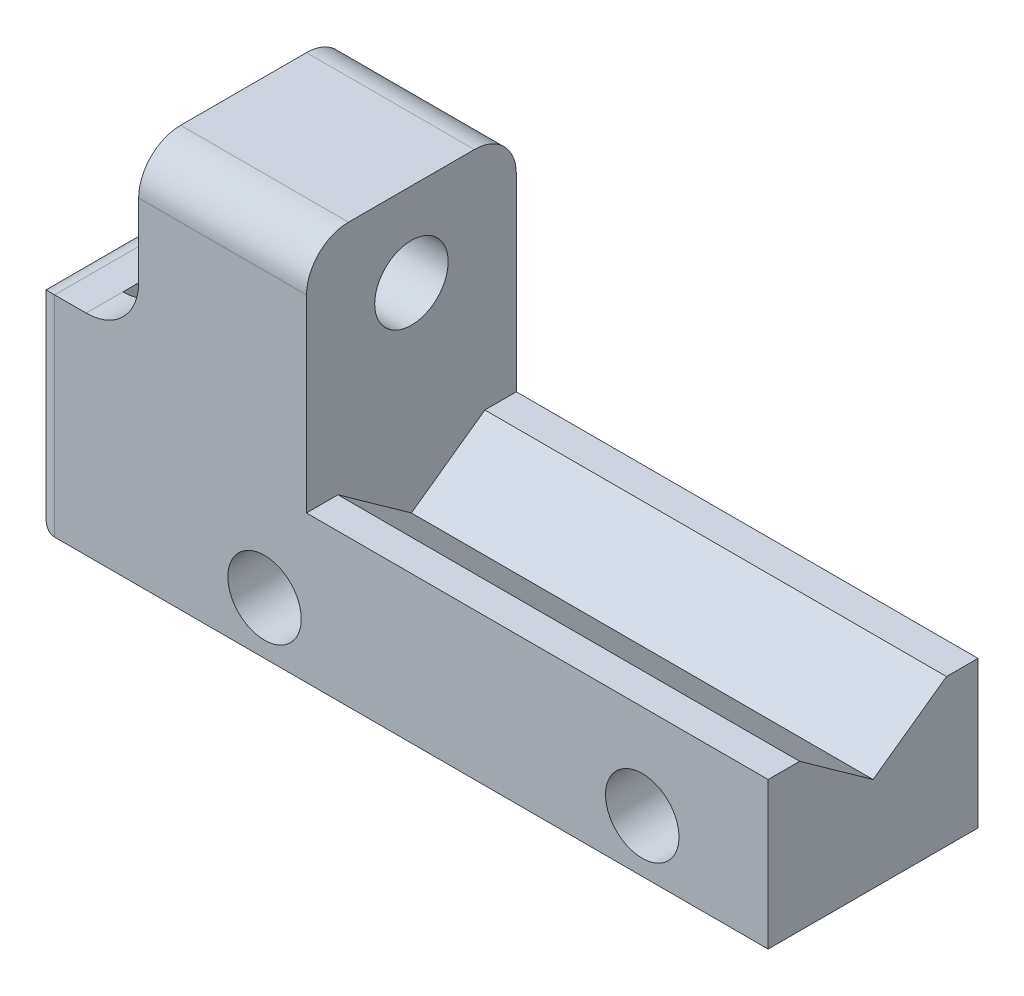
ISO-10303-21;
HEADER;
FILE_DESCRIPTION(('STEP AP214'),'2;1');
FILE_NAME('part.step','',(''),(''),'','','');
FILE_SCHEMA(('AUTOMOTIVE_DESIGN { 1 0 10303 214 1 1 1 1 }'));
ENDSEC;
DATA;
#1=APPLICATION_CONTEXT('core data for automotive mechanical design processes');
#2=APPLICATION_PROTOCOL_DEFINITION('international standard','automotive_design',2000,#1);
#3=PRODUCT_CONTEXT('',#1,'mechanical');
#4=PRODUCT('Part','Part','',(#3));
#5=PRODUCT_RELATED_PRODUCT_CATEGORY('part','',(#4));
#6=PRODUCT_DEFINITION_FORMATION('','',#4);
#7=PRODUCT_DEFINITION_CONTEXT('part definition',#1,'design');
#8=PRODUCT_DEFINITION('design','',#6,#7);
#9=PRODUCT_DEFINITION_SHAPE('','',#8);
#10=(LENGTH_UNIT() NAMED_UNIT(*) SI_UNIT(.MILLI.,.METRE.));
#11=(NAMED_UNIT(*) PLANE_ANGLE_UNIT() SI_UNIT($,.RADIAN.));
#12=(NAMED_UNIT(*) SI_UNIT($,.STERADIAN.) SOLID_ANGLE_UNIT());
#13=UNCERTAINTY_MEASURE_WITH_UNIT(LENGTH_MEASURE(1.E-05),#10,'distance_accuracy_value','');
#14=(GEOMETRIC_REPRESENTATION_CONTEXT(3) GLOBAL_UNCERTAINTY_ASSIGNED_CONTEXT((#13)) GLOBAL_UNIT_ASSIGNED_CONTEXT((#10,
#11,#12)) REPRESENTATION_CONTEXT('',''));
#15=CARTESIAN_POINT('',(0.,0.,0.));
#16=DIRECTION('',(0.,0.,1.));
#17=DIRECTION('',(1.,0.,0.));
#18=AXIS2_PLACEMENT_3D('',#15,#16,#17);
#19=CARTESIAN_POINT('',(-18.5,0.,0.));
#20=DIRECTION('',(1.,0.,0.));
#21=DIRECTION('',(0.,0.,-1.));
#22=AXIS2_PLACEMENT_3D('',#19,#20,#21);
#23=PLANE('',#22);
#24=DIRECTION('',(0.,0.,-1.));
#25=VECTOR('',#24,1.);
#26=CARTESIAN_POINT('',(-18.5,4.5,0.));
#27=LINE('',#26,#25);
#28=CARTESIAN_POINT('',(-18.5,4.5,9.));
#29=VERTEX_POINT('',#28);
#30=CARTESIAN_POINT('',(-18.5,4.5,1.));
#31=VERTEX_POINT('',#30);
#32=EDGE_CURVE('E372',#29,#31,#27,.T.);
#33=ORIENTED_EDGE('',*,*,#32,.T.);
#34=DIRECTION('',(0.,-1.,0.));
#35=VECTOR('',#34,1.);
#36=CARTESIAN_POINT('',(-18.5,0.,1.));
#37=LINE('',#36,#35);
#38=CARTESIAN_POINT('',(-18.5,-3.5,1.));
#39=VERTEX_POINT('',#38);
#40=EDGE_CURVE('E306',#31,#39,#37,.T.);
#41=ORIENTED_EDGE('',*,*,#40,.T.);
#42=DIRECTION('',(0.,0.,1.));
#43=VECTOR('',#42,1.);
#44=CARTESIAN_POINT('',(-18.5,-3.5,0.));
#45=LINE('',#44,#43);
#46=CARTESIAN_POINT('',(-18.5,-3.5,9.));
#47=VERTEX_POINT('',#46);
#48=EDGE_CURVE('E375',#39,#47,#45,.T.);
#49=ORIENTED_EDGE('',*,*,#48,.T.);
#50=DIRECTION('',(0.,1.,0.));
#51=VECTOR('',#50,1.);
#52=CARTESIAN_POINT('',(-18.5,5.5,9.));
#53=LINE('',#52,#51);
#54=EDGE_CURVE('E374',#47,#29,#53,.T.);
#55=ORIENTED_EDGE('',*,*,#54,.T.);
#56=EDGE_LOOP('',(#33,#41,#49,#55));
#57=FACE_BOUND('',#56,.T.);
#58=DIRECTION('',(0.,0.,1.));
#59=VECTOR('',#58,1.);
#60=CARTESIAN_POINT('',(-18.5,1.75,0.));
#61=LINE('',#60,#59);
#62=CARTESIAN_POINT('',(-18.5,1.75,1.75));
#63=VERTEX_POINT('',#62);
#64=CARTESIAN_POINT('',(-18.5,1.75,8.25));
#65=VERTEX_POINT('',#64);
#66=EDGE_CURVE('E221',#63,#65,#61,.T.);
#67=ORIENTED_EDGE('',*,*,#66,.T.);
#68=DIRECTION('',(0.,-1.,0.));
#69=VECTOR('',#68,1.);
#70=CARTESIAN_POINT('',(-18.5,0.,8.25));
#71=LINE('',#70,#69);
#72=CARTESIAN_POINT('',(-18.5,-0.75,8.25));
#73=VERTEX_POINT('',#72);
#74=EDGE_CURVE('E228',#65,#73,#71,.T.);
#75=ORIENTED_EDGE('',*,*,#74,.T.);
#76=DIRECTION('',(0.,0.,-1.));
#77=VECTOR('',#76,1.);
#78=CARTESIAN_POINT('',(-18.5,-0.75,0.));
#79=LINE('',#78,#77);
#80=CARTESIAN_POINT('',(-18.5,-0.75,1.75));
#81=VERTEX_POINT('',#80);
#82=EDGE_CURVE('E226',#73,#81,#79,.T.);
#83=ORIENTED_EDGE('',*,*,#82,.T.);
#84=DIRECTION('',(0.,1.,0.));
#85=VECTOR('',#84,1.);
#86=CARTESIAN_POINT('',(-18.5,0.,1.75));
#87=LINE('',#86,#85);
#88=EDGE_CURVE('E193',#81,#63,#87,.T.);
#89=ORIENTED_EDGE('',*,*,#88,.T.);
#90=EDGE_LOOP('',(#67,#75,#83,#89));
#91=FACE_BOUND('',#90,.T.);
#92=ADVANCED_FACE('F37',(#57,#91),#23,.F.);
#93=CARTESIAN_POINT('',(-13.5,4.5,10.));
#94=DIRECTION('',(1.,0.,0.));
#95=DIRECTION('',(0.,0.,-1.));
#96=AXIS2_PLACEMENT_3D('',#93,#94,#95);
#97=PLANE('',#96);
#98=CARTESIAN_POINT('',(-13.5,9.5,5.));
#99=DIRECTION('',(-1.,0.,0.));
#100=DIRECTION('',(0.,0.,1.));
#101=AXIS2_PLACEMENT_3D('',#98,#99,#100);
#102=CIRCLE('',#101,1.75);
#103=CARTESIAN_POINT('',(-13.5,9.5,6.75));
#104=VERTEX_POINT('',#103);
#105=EDGE_CURVE('E497',#104,#104,#102,.T.);
#106=ORIENTED_EDGE('',*,*,#105,.F.);
#107=EDGE_LOOP('',(#106));
#108=FACE_BOUND('',#107,.T.);
#109=DIRECTION('',(0.,1.,0.));
#110=VECTOR('',#109,1.);
#111=CARTESIAN_POINT('',(-13.5,-0.750000000000001,8.25));
#112=LINE('',#111,#110);
#113=CARTESIAN_POINT('',(-13.5,-0.750000000000001,8.25));
#114=VERTEX_POINT('',#113);
#115=CARTESIAN_POINT('',(-13.5,8.,8.25));
#116=VERTEX_POINT('',#115);
#117=EDGE_CURVE('E222',#114,#116,#112,.T.);
#118=ORIENTED_EDGE('',*,*,#117,.T.);
#119=DIRECTION('',(0.,0.,-1.));
#120=VECTOR('',#119,1.);
#121=CARTESIAN_POINT('',(-13.5,8.,10.));
#122=LINE('',#121,#120);
#123=CARTESIAN_POINT('',(-13.5,8.,10.));
#124=VERTEX_POINT('',#123);
#125=EDGE_CURVE('E364',#116,#124,#122,.F.);
#126=ORIENTED_EDGE('',*,*,#125,.T.);
#127=DIRECTION('',(0.,-1.,0.));
#128=VECTOR('',#127,1.);
#129=CARTESIAN_POINT('',(-13.5,4.5,10.));
#130=LINE('',#129,#128);
#131=CARTESIAN_POINT('',(-13.5,11.5,10.));
#132=VERTEX_POINT('',#131);
#133=EDGE_CURVE('E293',#132,#124,#130,.T.);
#134=ORIENTED_EDGE('',*,*,#133,.F.);
#135=CARTESIAN_POINT('',(-13.5,11.5,8.));
#136=DIRECTION('',(1.,0.,0.));
#137=DIRECTION('',(0.,0.,-1.));
#138=AXIS2_PLACEMENT_3D('',#135,#136,#137);
#139=CIRCLE('',#138,2.);
#140=CARTESIAN_POINT('',(-13.5,13.5,8.));
#141=VERTEX_POINT('',#140);
#142=EDGE_CURVE('E407',#132,#141,#139,.F.);
#143=ORIENTED_EDGE('',*,*,#142,.T.);
#144=DIRECTION('',(0.,0.,-1.));
#145=VECTOR('',#144,1.);
#146=CARTESIAN_POINT('',(-13.5,13.5,10.));
#147=LINE('',#146,#145);
#148=CARTESIAN_POINT('',(-13.5,13.5,2.));
#149=VERTEX_POINT('',#148);
#150=EDGE_CURVE('E236',#141,#149,#147,.T.);
#151=ORIENTED_EDGE('',*,*,#150,.T.);
#152=CARTESIAN_POINT('',(-13.5,11.5,2.));
#153=DIRECTION('',(1.,0.,0.));
#154=DIRECTION('',(0.,0.,-1.));
#155=AXIS2_PLACEMENT_3D('',#152,#153,#154);
#156=CIRCLE('',#155,2.);
#157=CARTESIAN_POINT('',(-13.5,11.5,0.));
#158=VERTEX_POINT('',#157);
#159=EDGE_CURVE('E359',#149,#158,#156,.F.);
#160=ORIENTED_EDGE('',*,*,#159,.T.);
#161=DIRECTION('',(0.,-1.,0.));
#162=VECTOR('',#161,1.);
#163=CARTESIAN_POINT('',(-13.5,4.5,0.));
#164=LINE('',#163,#162);
#165=CARTESIAN_POINT('',(-13.5,8.,0.));
#166=VERTEX_POINT('',#165);
#167=EDGE_CURVE('E287',#158,#166,#164,.T.);
#168=ORIENTED_EDGE('',*,*,#167,.T.);
#169=DIRECTION('',(0.,0.,-1.));
#170=VECTOR('',#169,1.);
#171=CARTESIAN_POINT('',(-13.5,8.,1.75));
#172=LINE('',#171,#170);
#173=CARTESIAN_POINT('',(-13.5,8.,1.75));
#174=VERTEX_POINT('',#173);
#175=EDGE_CURVE('E210',#166,#174,#172,.F.);
#176=ORIENTED_EDGE('',*,*,#175,.T.);
#177=DIRECTION('',(0.,1.,0.));
#178=VECTOR('',#177,1.);
#179=CARTESIAN_POINT('',(-13.5,-0.750000000000001,1.75));
#180=LINE('',#179,#178);
#181=CARTESIAN_POINT('',(-13.5,-0.750000000000001,1.75));
#182=VERTEX_POINT('',#181);
#183=EDGE_CURVE('E190',#182,#174,#180,.T.);
#184=ORIENTED_EDGE('',*,*,#183,.F.);
#185=DIRECTION('',(0.,0.,-1.));
#186=VECTOR('',#185,1.);
#187=CARTESIAN_POINT('',(-13.5,-0.750000000000001,5.));
#188=LINE('',#187,#186);
#189=EDGE_CURVE('E201',#114,#182,#188,.T.);
#190=ORIENTED_EDGE('',*,*,#189,.F.);
#191=EDGE_LOOP('',(#118,#126,#134,#143,#151,#160,#168,#176,#184,#190));
#192=FACE_BOUND('',#191,.T.);
#193=ADVANCED_FACE('F207',(#108,#192),#97,.F.);
#194=CARTESIAN_POINT('',(0.,2.5,0.));
#195=DIRECTION('',(0.,-1.,0.));
#196=DIRECTION('',(0.,0.,-1.));
#197=AXIS2_PLACEMENT_3D('',#194,#195,#196);
#198=PLANE('',#197);
#199=DIRECTION('',(0.,0.,-1.));
#200=VECTOR('',#199,1.);
#201=CARTESIAN_POINT('',(-5.5,2.5,0.));
#202=LINE('',#201,#200);
#203=CARTESIAN_POINT('',(-5.5,2.5,1.5));
#204=VERTEX_POINT('',#203);
#205=CARTESIAN_POINT('',(-5.5,2.5,0.));
#206=VERTEX_POINT('',#205);
#207=EDGE_CURVE('E273',#204,#206,#202,.T.);
#208=ORIENTED_EDGE('',*,*,#207,.F.);
#209=DIRECTION('',(1.,0.,0.));
#210=VECTOR('',#209,1.);
#211=CARTESIAN_POINT('',(-15.9330343736593,2.5,1.5));
#212=LINE('',#211,#210);
#213=CARTESIAN_POINT('',(16.5,2.5,1.5));
#214=VERTEX_POINT('',#213);
#215=EDGE_CURVE('E276',#204,#214,#212,.T.);
#216=ORIENTED_EDGE('',*,*,#215,.T.);
#217=DIRECTION('',(0.,0.,1.));
#218=VECTOR('',#217,1.);
#219=CARTESIAN_POINT('',(16.5,2.5,1.5));
#220=LINE('',#219,#218);
#221=CARTESIAN_POINT('',(16.5,2.5,0.));
#222=VERTEX_POINT('',#221);
#223=EDGE_CURVE('E249',#222,#214,#220,.T.);
#224=ORIENTED_EDGE('',*,*,#223,.F.);
#225=DIRECTION('',(-1.,0.,0.));
#226=VECTOR('',#225,1.);
#227=CARTESIAN_POINT('',(-8.5,2.5,0.));
#228=LINE('',#227,#226);
#229=EDGE_CURVE('E284',#222,#206,#228,.T.);
#230=ORIENTED_EDGE('',*,*,#229,.T.);
#231=EDGE_LOOP('',(#208,#216,#224,#230));
#232=FACE_BOUND('',#231,.T.);
#233=ADVANCED_FACE('F438',(#232),#198,.F.);
#234=DIRECTION('',(0.,0.,-1.));
#235=VECTOR('',#234,1.);
#236=CARTESIAN_POINT('',(-5.5,2.5,0.));
#237=LINE('',#236,#235);
#238=CARTESIAN_POINT('',(-5.5,2.5,10.));
#239=VERTEX_POINT('',#238);
#240=CARTESIAN_POINT('',(-5.5,2.5,8.5));
#241=VERTEX_POINT('',#240);
#242=EDGE_CURVE('E271',#239,#241,#237,.T.);
#243=ORIENTED_EDGE('',*,*,#242,.F.);
#244=DIRECTION('',(1.,0.,0.));
#245=VECTOR('',#244,1.);
#246=CARTESIAN_POINT('',(-8.5,2.5,10.));
#247=LINE('',#246,#245);
#248=CARTESIAN_POINT('',(16.5,2.5,10.));
#249=VERTEX_POINT('',#248);
#250=EDGE_CURVE('E282',#239,#249,#247,.T.);
#251=ORIENTED_EDGE('',*,*,#250,.T.);
#252=DIRECTION('',(0.,0.,1.));
#253=VECTOR('',#252,1.);
#254=CARTESIAN_POINT('',(16.5,2.5,10.));
#255=LINE('',#254,#253);
#256=CARTESIAN_POINT('',(16.5,2.5,8.5));
#257=VERTEX_POINT('',#256);
#258=EDGE_CURVE('E258',#257,#249,#255,.T.);
#259=ORIENTED_EDGE('',*,*,#258,.F.);
#260=DIRECTION('',(1.,0.,0.));
#261=VECTOR('',#260,1.);
#262=CARTESIAN_POINT('',(-15.9330343736593,2.5,8.5));
#263=LINE('',#262,#261);
#264=EDGE_CURVE('E277',#241,#257,#263,.T.);
#265=ORIENTED_EDGE('',*,*,#264,.F.);
#266=EDGE_LOOP('',(#243,#251,#259,#265));
#267=FACE_BOUND('',#266,.T.);
#268=ADVANCED_FACE('F450',(#267),#198,.F.);
#269=CARTESIAN_POINT('',(-15.9330343736593,2.36486486486487,1.68918918918919));
#270=DIRECTION('',(0.,-0.813733471206735,-0.581238193719096));
#271=DIRECTION('',(0.,0.581238193719097,-0.813733471206735));
#272=AXIS2_PLACEMENT_3D('',#269,#270,#271);
#273=PLANE('',#272);
#274=DIRECTION('',(1.,0.,0.));
#275=VECTOR('',#274,1.);
#276=CARTESIAN_POINT('',(-15.9330343736593,0.,5.));
#277=LINE('',#276,#275);
#278=CARTESIAN_POINT('',(-5.5,0.,5.));
#279=VERTEX_POINT('',#278);
#280=CARTESIAN_POINT('',(16.5,0.,5.));
#281=VERTEX_POINT('',#280);
#282=EDGE_CURVE('E279',#279,#281,#277,.T.);
#283=ORIENTED_EDGE('',*,*,#282,.T.);
#284=DIRECTION('',(0.,-0.581238193719096,0.813733471206735));
#285=VECTOR('',#284,1.);
#286=CARTESIAN_POINT('',(16.5,0.,5.));
#287=LINE('',#286,#285);
#288=EDGE_CURVE('E252',#214,#281,#287,.T.);
#289=ORIENTED_EDGE('',*,*,#288,.F.);
#290=ORIENTED_EDGE('',*,*,#215,.F.);
#291=DIRECTION('',(0.,0.581238193719097,-0.813733471206735));
#292=VECTOR('',#291,1.);
#293=CARTESIAN_POINT('',(-5.5,2.36486486486487,1.68918918918919));
#294=LINE('',#293,#292);
#295=EDGE_CURVE('E269',#279,#204,#294,.T.);
#296=ORIENTED_EDGE('',*,*,#295,.F.);
#297=EDGE_LOOP('',(#283,#289,#290,#296));
#298=FACE_BOUND('',#297,.T.);
#299=ADVANCED_FACE('F458',(#298),#273,.F.);
#300=CARTESIAN_POINT('',(-15.9330343736593,-2.36486486486486,1.68918918918919));
#301=DIRECTION('',(0.,-0.813733471206735,0.581238193719096));
#302=DIRECTION('',(0.,-0.581238193719097,-0.813733471206735));
#303=AXIS2_PLACEMENT_3D('',#300,#301,#302);
#304=PLANE('',#303);
#305=DIRECTION('',(0.,0.581238193719097,0.813733471206735));
#306=VECTOR('',#305,1.);
#307=CARTESIAN_POINT('',(16.5,2.5,8.5));
#308=LINE('',#307,#306);
#309=EDGE_CURVE('E255',#281,#257,#308,.T.);
#310=ORIENTED_EDGE('',*,*,#309,.F.);
#311=ORIENTED_EDGE('',*,*,#282,.F.);
#312=DIRECTION('',(0.,-0.581238193719097,-0.813733471206735));
#313=VECTOR('',#312,1.);
#314=CARTESIAN_POINT('',(-5.5,-2.36486486486486,1.68918918918919));
#315=LINE('',#314,#313);
#316=EDGE_CURVE('E402',#241,#279,#315,.T.);
#317=ORIENTED_EDGE('',*,*,#316,.F.);
#318=ORIENTED_EDGE('',*,*,#264,.T.);
#319=EDGE_LOOP('',(#310,#311,#317,#318));
#320=FACE_BOUND('',#319,.T.);
#321=ADVANCED_FACE('F455',(#320),#304,.F.);
#322=CARTESIAN_POINT('',(-13.5,-4.5,10.));
#323=DIRECTION('',(0.,1.,0.));
#324=DIRECTION('',(-1.,0.,0.));
#325=AXIS2_PLACEMENT_3D('',#322,#323,#324);
#326=PLANE('',#325);
#327=DIRECTION('',(1.,0.,0.));
#328=VECTOR('',#327,1.);
#329=CARTESIAN_POINT('',(-13.5,-4.5,10.));
#330=LINE('',#329,#328);
#331=CARTESIAN_POINT('',(-17.5,-4.5,10.));
#332=VERTEX_POINT('',#331);
#333=CARTESIAN_POINT('',(16.5,-4.5,10.));
#334=VERTEX_POINT('',#333);
#335=EDGE_CURVE('E290',#332,#334,#330,.T.);
#336=ORIENTED_EDGE('',*,*,#335,.F.);
#337=DIRECTION('',(0.,0.,1.));
#338=VECTOR('',#337,1.);
#339=CARTESIAN_POINT('',(-17.5,-4.5,10.));
#340=LINE('',#339,#338);
#341=CARTESIAN_POINT('',(-17.5,-4.5,0.));
#342=VERTEX_POINT('',#341);
#343=EDGE_CURVE('E311',#332,#342,#340,.F.);
#344=ORIENTED_EDGE('',*,*,#343,.T.);
#345=DIRECTION('',(1.,0.,0.));
#346=VECTOR('',#345,1.);
#347=CARTESIAN_POINT('',(-13.5,-4.5,0.));
#348=LINE('',#347,#346);
#349=CARTESIAN_POINT('',(16.5,-4.5,0.));
#350=VERTEX_POINT('',#349);
#351=EDGE_CURVE('E297',#342,#350,#348,.T.);
#352=ORIENTED_EDGE('',*,*,#351,.T.);
#353=DIRECTION('',(0.,0.,-1.));
#354=VECTOR('',#353,1.);
#355=CARTESIAN_POINT('',(16.5,-4.5,0.));
#356=LINE('',#355,#354);
#357=EDGE_CURVE('E239',#334,#350,#356,.T.);
#358=ORIENTED_EDGE('',*,*,#357,.F.);
#359=EDGE_LOOP('',(#336,#344,#352,#358));
#360=FACE_BOUND('',#359,.T.);
#361=ADVANCED_FACE('F443',(#360),#326,.F.);
#362=CARTESIAN_POINT('',(0.,0.,10.));
#363=DIRECTION('',(0.,0.,1.));
#364=DIRECTION('',(1.,0.,0.));
#365=AXIS2_PLACEMENT_3D('',#362,#363,#364);
#366=PLANE('',#365);
#367=CARTESIAN_POINT('',(10.5,-2.,10.));
#368=DIRECTION('',(0.,0.,-1.));
#369=DIRECTION('',(-1.,0.,0.));
#370=AXIS2_PLACEMENT_3D('',#367,#368,#369);
#371=CIRCLE('',#370,1.75);
#372=CARTESIAN_POINT('',(8.75,-2.,10.));
#373=VERTEX_POINT('',#372);
#374=EDGE_CURVE('E499',#373,#373,#371,.T.);
#375=ORIENTED_EDGE('',*,*,#374,.T.);
#376=EDGE_LOOP('',(#375));
#377=FACE_BOUND('',#376,.T.);
#378=CARTESIAN_POINT('',(-7.5,-2.,10.));
#379=DIRECTION('',(0.,0.,-1.));
#380=DIRECTION('',(-1.,0.,0.));
#381=AXIS2_PLACEMENT_3D('',#378,#379,#380);
#382=CIRCLE('',#381,1.75);
#383=CARTESIAN_POINT('',(-9.25,-2.,10.));
#384=VERTEX_POINT('',#383);
#385=EDGE_CURVE('E318',#384,#384,#382,.T.);
#386=ORIENTED_EDGE('',*,*,#385,.T.);
#387=EDGE_LOOP('',(#386));
#388=FACE_BOUND('',#387,.T.);
#389=DIRECTION('',(1.,0.,0.));
#390=VECTOR('',#389,1.);
#391=CARTESIAN_POINT('',(-18.5,5.5,10.));
#392=LINE('',#391,#390);
#393=CARTESIAN_POINT('',(-17.5,5.5,10.));
#394=VERTEX_POINT('',#393);
#395=CARTESIAN_POINT('',(-16.,5.5,10.));
#396=VERTEX_POINT('',#395);
#397=EDGE_CURVE('E243',#394,#396,#392,.T.);
#398=ORIENTED_EDGE('',*,*,#397,.F.);
#399=DIRECTION('',(0.,1.,0.));
#400=VECTOR('',#399,1.);
#401=CARTESIAN_POINT('',(-17.5,-4.5,10.));
#402=LINE('',#401,#400);
#403=EDGE_CURVE('E46',#394,#332,#402,.F.);
#404=ORIENTED_EDGE('',*,*,#403,.T.);
#405=ORIENTED_EDGE('',*,*,#335,.T.);
#406=DIRECTION('',(0.,-1.,0.));
#407=VECTOR('',#406,1.);
#408=CARTESIAN_POINT('',(16.5,-4.5,10.));
#409=LINE('',#408,#407);
#410=EDGE_CURVE('E261',#249,#334,#409,.T.);
#411=ORIENTED_EDGE('',*,*,#410,.F.);
#412=ORIENTED_EDGE('',*,*,#250,.F.);
#413=DIRECTION('',(0.,1.,0.));
#414=VECTOR('',#413,1.);
#415=CARTESIAN_POINT('',(-5.5,-4.5,10.));
#416=LINE('',#415,#414);
#417=CARTESIAN_POINT('',(-5.5,11.5,10.));
#418=VERTEX_POINT('',#417);
#419=EDGE_CURVE('E264',#239,#418,#416,.T.);
#420=ORIENTED_EDGE('',*,*,#419,.T.);
#421=DIRECTION('',(-1.,0.,0.));
#422=VECTOR('',#421,1.);
#423=CARTESIAN_POINT('',(-13.5,11.5,10.));
#424=LINE('',#423,#422);
#425=EDGE_CURVE('E404',#418,#132,#424,.T.);
#426=ORIENTED_EDGE('',*,*,#425,.T.);
#427=ORIENTED_EDGE('',*,*,#133,.T.);
#428=CARTESIAN_POINT('',(-16.,8.,10.));
#429=DIRECTION('',(0.,0.,1.));
#430=DIRECTION('',(1.,0.,0.));
#431=AXIS2_PLACEMENT_3D('',#428,#429,#430);
#432=CIRCLE('',#431,2.5);
#433=EDGE_CURVE('E367',#124,#396,#432,.F.);
#434=ORIENTED_EDGE('',*,*,#433,.T.);
#435=EDGE_LOOP('',(#398,#404,#405,#411,#412,#420,#426,#427,#434));
#436=FACE_BOUND('',#435,.T.);
#437=ADVANCED_FACE('F444',(#377,#388,#436),#366,.T.);
#438=CARTESIAN_POINT('',(0.,0.,0.));
#439=DIRECTION('',(0.,0.,1.));
#440=DIRECTION('',(1.,0.,0.));
#441=AXIS2_PLACEMENT_3D('',#438,#439,#440);
#442=PLANE('',#441);
#443=CARTESIAN_POINT('',(10.5,-2.,0.));
#444=DIRECTION('',(0.,0.,-1.));
#445=DIRECTION('',(-1.,0.,0.));
#446=AXIS2_PLACEMENT_3D('',#443,#444,#445);
#447=CIRCLE('',#446,1.75);
#448=CARTESIAN_POINT('',(8.75,-2.,0.));
#449=VERTEX_POINT('',#448);
#450=EDGE_CURVE('E496',#449,#449,#447,.T.);
#451=ORIENTED_EDGE('',*,*,#450,.F.);
#452=EDGE_LOOP('',(#451));
#453=FACE_BOUND('',#452,.T.);
#454=CARTESIAN_POINT('',(-7.5,-2.,0.));
#455=DIRECTION('',(0.,0.,-1.));
#456=DIRECTION('',(-1.,0.,0.));
#457=AXIS2_PLACEMENT_3D('',#454,#455,#456);
#458=CIRCLE('',#457,1.75);
#459=CARTESIAN_POINT('',(-9.25,-2.,0.));
#460=VERTEX_POINT('',#459);
#461=EDGE_CURVE('E507',#460,#460,#458,.T.);
#462=ORIENTED_EDGE('',*,*,#461,.F.);
#463=EDGE_LOOP('',(#462));
#464=FACE_BOUND('',#463,.T.);
#465=ORIENTED_EDGE('',*,*,#351,.F.);
#466=DIRECTION('',(0.,-1.,0.));
#467=VECTOR('',#466,1.);
#468=CARTESIAN_POINT('',(-17.5,0.,0.));
#469=LINE('',#468,#467);
#470=CARTESIAN_POINT('',(-17.5,5.5,0.));
#471=VERTEX_POINT('',#470);
#472=EDGE_CURVE('E308',#342,#471,#469,.F.);
#473=ORIENTED_EDGE('',*,*,#472,.T.);
#474=DIRECTION('',(1.,0.,0.));
#475=VECTOR('',#474,1.);
#476=CARTESIAN_POINT('',(-18.5,5.5,0.));
#477=LINE('',#476,#475);
#478=CARTESIAN_POINT('',(-16.,5.5,0.));
#479=VERTEX_POINT('',#478);
#480=EDGE_CURVE('E233',#471,#479,#477,.T.);
#481=ORIENTED_EDGE('',*,*,#480,.T.);
#482=CARTESIAN_POINT('',(-16.,8.,0.));
#483=DIRECTION('',(0.,0.,1.));
#484=DIRECTION('',(1.,0.,0.));
#485=AXIS2_PLACEMENT_3D('',#482,#483,#484);
#486=CIRCLE('',#485,2.5);
#487=EDGE_CURVE('E358',#479,#166,#486,.T.);
#488=ORIENTED_EDGE('',*,*,#487,.T.);
#489=ORIENTED_EDGE('',*,*,#167,.F.);
#490=DIRECTION('',(1.,0.,0.));
#491=VECTOR('',#490,1.);
#492=CARTESIAN_POINT('',(0.,11.5,0.));
#493=LINE('',#492,#491);
#494=CARTESIAN_POINT('',(-5.5,11.5,0.));
#495=VERTEX_POINT('',#494);
#496=EDGE_CURVE('E413',#158,#495,#493,.T.);
#497=ORIENTED_EDGE('',*,*,#496,.T.);
#498=DIRECTION('',(0.,-1.,0.));
#499=VECTOR('',#498,1.);
#500=CARTESIAN_POINT('',(-5.5,-4.5,0.));
#501=LINE('',#500,#499);
#502=EDGE_CURVE('E267',#495,#206,#501,.T.);
#503=ORIENTED_EDGE('',*,*,#502,.T.);
#504=ORIENTED_EDGE('',*,*,#229,.F.);
#505=DIRECTION('',(0.,1.,0.));
#506=VECTOR('',#505,1.);
#507=CARTESIAN_POINT('',(16.5,2.5,0.));
#508=LINE('',#507,#506);
#509=EDGE_CURVE('E246',#350,#222,#508,.T.);
#510=ORIENTED_EDGE('',*,*,#509,.F.);
#511=EDGE_LOOP('',(#465,#473,#481,#488,#489,#497,#503,#504,#510));
#512=FACE_BOUND('',#511,.T.);
#513=ADVANCED_FACE('F395',(#453,#464,#512),#442,.F.);
#514=CARTESIAN_POINT('',(-5.5,0.,0.));
#515=DIRECTION('',(-1.,0.,0.));
#516=DIRECTION('',(0.,0.,1.));
#517=AXIS2_PLACEMENT_3D('',#514,#515,#516);
#518=PLANE('',#517);
#519=CARTESIAN_POINT('',(-5.5,9.5,5.));
#520=DIRECTION('',(-1.,0.,0.));
#521=DIRECTION('',(0.,0.,1.));
#522=AXIS2_PLACEMENT_3D('',#519,#520,#521);
#523=CIRCLE('',#522,1.75);
#524=CARTESIAN_POINT('',(-5.5,9.5,6.75));
#525=VERTEX_POINT('',#524);
#526=EDGE_CURVE('E41',#525,#525,#523,.T.);
#527=ORIENTED_EDGE('',*,*,#526,.T.);
#528=EDGE_LOOP('',(#527));
#529=FACE_BOUND('',#528,.T.);
#530=ORIENTED_EDGE('',*,*,#242,.T.);
#531=ORIENTED_EDGE('',*,*,#316,.T.);
#532=ORIENTED_EDGE('',*,*,#295,.T.);
#533=ORIENTED_EDGE('',*,*,#207,.T.);
#534=ORIENTED_EDGE('',*,*,#502,.F.);
#535=CARTESIAN_POINT('',(-5.5,11.5,2.));
#536=DIRECTION('',(-1.,0.,0.));
#537=DIRECTION('',(0.,0.,1.));
#538=AXIS2_PLACEMENT_3D('',#535,#536,#537);
#539=CIRCLE('',#538,2.);
#540=CARTESIAN_POINT('',(-5.5,13.5,2.));
#541=VERTEX_POINT('',#540);
#542=EDGE_CURVE('E416',#495,#541,#539,.F.);
#543=ORIENTED_EDGE('',*,*,#542,.T.);
#544=DIRECTION('',(0.,0.,-1.));
#545=VECTOR('',#544,1.);
#546=CARTESIAN_POINT('',(-5.5,13.5,10.));
#547=LINE('',#546,#545);
#548=CARTESIAN_POINT('',(-5.5,13.5,8.));
#549=VERTEX_POINT('',#548);
#550=EDGE_CURVE('E240',#549,#541,#547,.T.);
#551=ORIENTED_EDGE('',*,*,#550,.F.);
#552=CARTESIAN_POINT('',(-5.5,11.5,8.));
#553=DIRECTION('',(-1.,0.,0.));
#554=DIRECTION('',(0.,0.,1.));
#555=AXIS2_PLACEMENT_3D('',#552,#553,#554);
#556=CIRCLE('',#555,2.);
#557=EDGE_CURVE('E411',#549,#418,#556,.F.);
#558=ORIENTED_EDGE('',*,*,#557,.T.);
#559=ORIENTED_EDGE('',*,*,#419,.F.);
#560=EDGE_LOOP('',(#530,#531,#532,#533,#534,#543,#551,#558,#559));
#561=FACE_BOUND('',#560,.T.);
#562=ADVANCED_FACE('F432',(#529,#561),#518,.F.);
#563=CARTESIAN_POINT('',(16.5,0.,0.));
#564=DIRECTION('',(-1.,0.,0.));
#565=DIRECTION('',(0.,0.,1.));
#566=AXIS2_PLACEMENT_3D('',#563,#564,#565);
#567=PLANE('',#566);
#568=ORIENTED_EDGE('',*,*,#357,.T.);
#569=ORIENTED_EDGE('',*,*,#509,.T.);
#570=ORIENTED_EDGE('',*,*,#223,.T.);
#571=ORIENTED_EDGE('',*,*,#288,.T.);
#572=ORIENTED_EDGE('',*,*,#309,.T.);
#573=ORIENTED_EDGE('',*,*,#258,.T.);
#574=ORIENTED_EDGE('',*,*,#410,.T.);
#575=EDGE_LOOP('',(#568,#569,#570,#571,#572,#573,#574));
#576=FACE_BOUND('',#575,.T.);
#577=ADVANCED_FACE('F440',(#576),#567,.F.);
#578=CARTESIAN_POINT('',(-13.5,13.5,10.));
#579=DIRECTION('',(0.,-1.,0.));
#580=DIRECTION('',(0.,0.,-1.));
#581=AXIS2_PLACEMENT_3D('',#578,#579,#580);
#582=PLANE('',#581);
#583=ORIENTED_EDGE('',*,*,#550,.T.);
#584=DIRECTION('',(1.,0.,0.));
#585=VECTOR('',#584,1.);
#586=CARTESIAN_POINT('',(-13.5,13.5,2.));
#587=LINE('',#586,#585);
#588=EDGE_CURVE('E361',#541,#149,#587,.F.);
#589=ORIENTED_EDGE('',*,*,#588,.T.);
#590=ORIENTED_EDGE('',*,*,#150,.F.);
#591=DIRECTION('',(-1.,0.,0.));
#592=VECTOR('',#591,1.);
#593=CARTESIAN_POINT('',(-5.5,13.5,8.));
#594=LINE('',#593,#592);
#595=EDGE_CURVE('E409',#141,#549,#594,.F.);
#596=ORIENTED_EDGE('',*,*,#595,.T.);
#597=EDGE_LOOP('',(#583,#589,#590,#596));
#598=FACE_BOUND('',#597,.T.);
#599=ADVANCED_FACE('F421',(#598),#582,.F.);
#600=CARTESIAN_POINT('',(0.,11.5,8.));
#601=DIRECTION('',(1.,0.,0.));
#602=DIRECTION('',(0.,0.,-1.));
#603=AXIS2_PLACEMENT_3D('',#600,#601,#602);
#604=CYLINDRICAL_SURFACE('',#603,2.);
#605=ORIENTED_EDGE('',*,*,#557,.F.);
#606=ORIENTED_EDGE('',*,*,#595,.F.);
#607=ORIENTED_EDGE('',*,*,#142,.F.);
#608=ORIENTED_EDGE('',*,*,#425,.F.);
#609=EDGE_LOOP('',(#605,#606,#607,#608));
#610=FACE_BOUND('',#609,.T.);
#611=ADVANCED_FACE('F482',(#610),#604,.T.);
#612=CARTESIAN_POINT('',(0.,11.5,2.));
#613=DIRECTION('',(1.,0.,0.));
#614=DIRECTION('',(0.,0.,-1.));
#615=AXIS2_PLACEMENT_3D('',#612,#613,#614);
#616=CYLINDRICAL_SURFACE('',#615,2.);
#617=ORIENTED_EDGE('',*,*,#159,.F.);
#618=ORIENTED_EDGE('',*,*,#588,.F.);
#619=ORIENTED_EDGE('',*,*,#542,.F.);
#620=ORIENTED_EDGE('',*,*,#496,.F.);
#621=EDGE_LOOP('',(#617,#618,#619,#620));
#622=FACE_BOUND('',#621,.T.);
#623=ADVANCED_FACE('F429',(#622),#616,.T.);
#624=CARTESIAN_POINT('',(-18.5,5.5,0.));
#625=DIRECTION('',(0.,-1.,0.));
#626=DIRECTION('',(0.,0.,-1.));
#627=AXIS2_PLACEMENT_3D('',#624,#625,#626);
#628=PLANE('',#627);
#629=ORIENTED_EDGE('',*,*,#480,.F.);
#630=DIRECTION('',(0.,0.,-1.));
#631=VECTOR('',#630,1.);
#632=CARTESIAN_POINT('',(-17.5,5.5,0.));
#633=LINE('',#632,#631);
#634=EDGE_CURVE('E11',#471,#394,#633,.F.);
#635=ORIENTED_EDGE('',*,*,#634,.T.);
#636=ORIENTED_EDGE('',*,*,#397,.T.);
#637=DIRECTION('',(0.,0.,-1.));
#638=VECTOR('',#637,1.);
#639=CARTESIAN_POINT('',(-16.,5.5,8.25));
#640=LINE('',#639,#638);
#641=CARTESIAN_POINT('',(-16.,5.5,8.25));
#642=VERTEX_POINT('',#641);
#643=EDGE_CURVE('E354',#396,#642,#640,.T.);
#644=ORIENTED_EDGE('',*,*,#643,.T.);
#645=DIRECTION('',(0.,0.,1.));
#646=VECTOR('',#645,1.);
#647=CARTESIAN_POINT('',(-16.,5.5,1.75));
#648=LINE('',#647,#646);
#649=CARTESIAN_POINT('',(-16.,5.5,1.75));
#650=VERTEX_POINT('',#649);
#651=EDGE_CURVE('E205',#650,#642,#648,.T.);
#652=ORIENTED_EDGE('',*,*,#651,.F.);
#653=DIRECTION('',(0.,0.,-1.));
#654=VECTOR('',#653,1.);
#655=CARTESIAN_POINT('',(-16.,5.5,0.));
#656=LINE('',#655,#654);
#657=EDGE_CURVE('E352',#650,#479,#656,.T.);
#658=ORIENTED_EDGE('',*,*,#657,.T.);
#659=EDGE_LOOP('',(#629,#635,#636,#644,#652,#658));
#660=FACE_BOUND('',#659,.T.);
#661=ADVANCED_FACE('F351',(#660),#628,.F.);
#662=CARTESIAN_POINT('',(-14.5,1.75,0.));
#663=DIRECTION('',(0.,-1.,0.));
#664=DIRECTION('',(0.,0.,-1.));
#665=AXIS2_PLACEMENT_3D('',#662,#663,#664);
#666=PLANE('',#665);
#667=DIRECTION('',(0.,0.,-1.));
#668=VECTOR('',#667,1.);
#669=CARTESIAN_POINT('',(-16.,1.75,0.));
#670=LINE('',#669,#668);
#671=CARTESIAN_POINT('',(-16.,1.75,8.25));
#672=VERTEX_POINT('',#671);
#673=CARTESIAN_POINT('',(-16.,1.75,1.75));
#674=VERTEX_POINT('',#673);
#675=EDGE_CURVE('E219',#672,#674,#670,.T.);
#676=ORIENTED_EDGE('',*,*,#675,.F.);
#677=DIRECTION('',(-1.,0.,0.));
#678=VECTOR('',#677,1.);
#679=CARTESIAN_POINT('',(-14.5,1.75,8.25));
#680=LINE('',#679,#678);
#681=EDGE_CURVE('E231',#672,#65,#680,.T.);
#682=ORIENTED_EDGE('',*,*,#681,.T.);
#683=ORIENTED_EDGE('',*,*,#66,.F.);
#684=DIRECTION('',(-1.,0.,0.));
#685=VECTOR('',#684,1.);
#686=CARTESIAN_POINT('',(-14.5,1.75,1.75));
#687=LINE('',#686,#685);
#688=EDGE_CURVE('E198',#674,#63,#687,.T.);
#689=ORIENTED_EDGE('',*,*,#688,.F.);
#690=EDGE_LOOP('',(#676,#682,#683,#689));
#691=FACE_BOUND('',#690,.T.);
#692=ADVANCED_FACE('F345',(#691),#666,.T.);
#693=CARTESIAN_POINT('',(-14.5,0.,8.25));
#694=DIRECTION('',(0.,0.,-1.));
#695=DIRECTION('',(-1.,0.,0.));
#696=AXIS2_PLACEMENT_3D('',#693,#694,#695);
#697=PLANE('',#696);
#698=ORIENTED_EDGE('',*,*,#681,.F.);
#699=DIRECTION('',(0.,1.,0.));
#700=VECTOR('',#699,1.);
#701=CARTESIAN_POINT('',(-16.,-0.750000000000001,8.25));
#702=LINE('',#701,#700);
#703=EDGE_CURVE('E215',#672,#642,#702,.T.);
#704=ORIENTED_EDGE('',*,*,#703,.T.);
#705=CARTESIAN_POINT('',(-16.,8.,8.25));
#706=DIRECTION('',(0.,0.,-1.));
#707=DIRECTION('',(-1.,0.,0.));
#708=AXIS2_PLACEMENT_3D('',#705,#706,#707);
#709=CIRCLE('',#708,2.5);
#710=EDGE_CURVE('E338',#642,#116,#709,.F.);
#711=ORIENTED_EDGE('',*,*,#710,.T.);
#712=ORIENTED_EDGE('',*,*,#117,.F.);
#713=DIRECTION('',(-1.,0.,0.));
#714=VECTOR('',#713,1.);
#715=CARTESIAN_POINT('',(-14.5,-0.75,8.25));
#716=LINE('',#715,#714);
#717=EDGE_CURVE('E197',#114,#73,#716,.T.);
#718=ORIENTED_EDGE('',*,*,#717,.T.);
#719=ORIENTED_EDGE('',*,*,#74,.F.);
#720=EDGE_LOOP('',(#698,#704,#711,#712,#718,#719));
#721=FACE_BOUND('',#720,.T.);
#722=ADVANCED_FACE('F337',(#721),#697,.T.);
#723=CARTESIAN_POINT('',(-14.5,-0.75,0.));
#724=DIRECTION('',(0.,1.,0.));
#725=DIRECTION('',(0.,0.,1.));
#726=AXIS2_PLACEMENT_3D('',#723,#724,#725);
#727=PLANE('',#726);
#728=ORIENTED_EDGE('',*,*,#82,.F.);
#729=ORIENTED_EDGE('',*,*,#717,.F.);
#730=ORIENTED_EDGE('',*,*,#189,.T.);
#731=DIRECTION('',(-1.,0.,0.));
#732=VECTOR('',#731,1.);
#733=CARTESIAN_POINT('',(-14.5,-0.75,1.75));
#734=LINE('',#733,#732);
#735=EDGE_CURVE('E185',#182,#81,#734,.T.);
#736=ORIENTED_EDGE('',*,*,#735,.T.);
#737=EDGE_LOOP('',(#728,#729,#730,#736));
#738=FACE_BOUND('',#737,.T.);
#739=ADVANCED_FACE('F202',(#738),#727,.T.);
#740=CARTESIAN_POINT('',(-14.5,0.,1.75));
#741=DIRECTION('',(0.,0.,1.));
#742=DIRECTION('',(1.,0.,0.));
#743=AXIS2_PLACEMENT_3D('',#740,#741,#742);
#744=PLANE('',#743);
#745=DIRECTION('',(0.,1.,0.));
#746=VECTOR('',#745,1.);
#747=CARTESIAN_POINT('',(-16.,-0.750000000000001,1.75));
#748=LINE('',#747,#746);
#749=EDGE_CURVE('E212',#674,#650,#748,.T.);
#750=ORIENTED_EDGE('',*,*,#749,.F.);
#751=ORIENTED_EDGE('',*,*,#688,.T.);
#752=ORIENTED_EDGE('',*,*,#88,.F.);
#753=ORIENTED_EDGE('',*,*,#735,.F.);
#754=ORIENTED_EDGE('',*,*,#183,.T.);
#755=CARTESIAN_POINT('',(-16.,8.,1.75));
#756=DIRECTION('',(0.,0.,1.));
#757=DIRECTION('',(1.,0.,0.));
#758=AXIS2_PLACEMENT_3D('',#755,#756,#757);
#759=CIRCLE('',#758,2.5);
#760=EDGE_CURVE('E347',#174,#650,#759,.F.);
#761=ORIENTED_EDGE('',*,*,#760,.T.);
#762=EDGE_LOOP('',(#750,#751,#752,#753,#754,#761));
#763=FACE_BOUND('',#762,.T.);
#764=ADVANCED_FACE('F188',(#763),#744,.T.);
#765=CARTESIAN_POINT('',(-16.,-0.750000000000001,1.75));
#766=DIRECTION('',(-1.,0.,0.));
#767=DIRECTION('',(0.,0.,1.));
#768=AXIS2_PLACEMENT_3D('',#765,#766,#767);
#769=PLANE('',#768);
#770=ORIENTED_EDGE('',*,*,#675,.T.);
#771=ORIENTED_EDGE('',*,*,#749,.T.);
#772=ORIENTED_EDGE('',*,*,#651,.T.);
#773=ORIENTED_EDGE('',*,*,#703,.F.);
#774=EDGE_LOOP('',(#770,#771,#772,#773));
#775=FACE_BOUND('',#774,.T.);
#776=ADVANCED_FACE('F342',(#775),#769,.F.);
#777=CARTESIAN_POINT('',(-16.,8.,0.));
#778=DIRECTION('',(0.,0.,1.));
#779=DIRECTION('',(1.,0.,0.));
#780=AXIS2_PLACEMENT_3D('',#777,#778,#779);
#781=CYLINDRICAL_SURFACE('',#780,2.5);
#782=ORIENTED_EDGE('',*,*,#433,.F.);
#783=ORIENTED_EDGE('',*,*,#125,.F.);
#784=ORIENTED_EDGE('',*,*,#710,.F.);
#785=ORIENTED_EDGE('',*,*,#643,.F.);
#786=EDGE_LOOP('',(#782,#783,#784,#785));
#787=FACE_BOUND('',#786,.T.);
#788=ADVANCED_FACE('F532',(#787),#781,.F.);
#789=CARTESIAN_POINT('',(-16.,8.,0.));
#790=DIRECTION('',(0.,0.,1.));
#791=DIRECTION('',(1.,0.,0.));
#792=AXIS2_PLACEMENT_3D('',#789,#790,#791);
#793=CYLINDRICAL_SURFACE('',#792,2.5);
#794=ORIENTED_EDGE('',*,*,#760,.F.);
#795=ORIENTED_EDGE('',*,*,#175,.F.);
#796=ORIENTED_EDGE('',*,*,#487,.F.);
#797=ORIENTED_EDGE('',*,*,#657,.F.);
#798=EDGE_LOOP('',(#794,#795,#796,#797));
#799=FACE_BOUND('',#798,.T.);
#800=ADVANCED_FACE('F357',(#799),#793,.F.);
#801=CARTESIAN_POINT('',(-17.5,0.,9.));
#802=DIRECTION('',(0.,-1.,0.));
#803=DIRECTION('',(0.,0.,-1.));
#804=AXIS2_PLACEMENT_3D('',#801,#802,#803);
#805=CYLINDRICAL_SURFACE('',#804,1.);
#806=CARTESIAN_POINT('',(-17.5,-3.5,9.));
#807=DIRECTION('',(0.,-0.707106781186547,-0.707106781186547));
#808=DIRECTION('',(0.,-0.707106781186547,0.707106781186547));
#809=AXIS2_PLACEMENT_3D('',#806,#807,#808);
#810=ELLIPSE('',#809,1.41421356237309,1.);
#811=EDGE_CURVE('E320',#332,#47,#810,.T.);
#812=ORIENTED_EDGE('',*,*,#811,.F.);
#813=ORIENTED_EDGE('',*,*,#403,.F.);
#814=CARTESIAN_POINT('',(-17.5,4.5,9.));
#815=DIRECTION('',(0.,0.707106781186547,-0.707106781186547));
#816=DIRECTION('',(0.,-0.707106781186547,-0.707106781186547));
#817=AXIS2_PLACEMENT_3D('',#814,#815,#816);
#818=ELLIPSE('',#817,1.41421356237309,1.);
#819=EDGE_CURVE('E322',#29,#394,#818,.T.);
#820=ORIENTED_EDGE('',*,*,#819,.F.);
#821=ORIENTED_EDGE('',*,*,#54,.F.);
#822=EDGE_LOOP('',(#812,#813,#820,#821));
#823=FACE_BOUND('',#822,.T.);
#824=ADVANCED_FACE('F39',(#823),#805,.T.);
#825=CARTESIAN_POINT('',(-17.5,4.5,0.));
#826=DIRECTION('',(0.,0.,-1.));
#827=DIRECTION('',(-1.,0.,0.));
#828=AXIS2_PLACEMENT_3D('',#825,#826,#827);
#829=CYLINDRICAL_SURFACE('',#828,1.);
#830=ORIENTED_EDGE('',*,*,#819,.T.);
#831=ORIENTED_EDGE('',*,*,#634,.F.);
#832=CARTESIAN_POINT('',(-17.5,4.5,1.));
#833=DIRECTION('',(0.,-0.707106781186547,-0.707106781186547));
#834=DIRECTION('',(0.,0.707106781186547,-0.707106781186547));
#835=AXIS2_PLACEMENT_3D('',#832,#833,#834);
#836=ELLIPSE('',#835,1.41421356237309,1.);
#837=EDGE_CURVE('E317',#31,#471,#836,.T.);
#838=ORIENTED_EDGE('',*,*,#837,.F.);
#839=ORIENTED_EDGE('',*,*,#32,.F.);
#840=EDGE_LOOP('',(#830,#831,#838,#839));
#841=FACE_BOUND('',#840,.T.);
#842=ADVANCED_FACE('F392',(#841),#829,.T.);
#843=CARTESIAN_POINT('',(-17.5,-3.5,0.));
#844=DIRECTION('',(0.,0.,1.));
#845=DIRECTION('',(1.,0.,0.));
#846=AXIS2_PLACEMENT_3D('',#843,#844,#845);
#847=CYLINDRICAL_SURFACE('',#846,1.);
#848=ORIENTED_EDGE('',*,*,#811,.T.);
#849=ORIENTED_EDGE('',*,*,#48,.F.);
#850=CARTESIAN_POINT('',(-17.5,-3.5,1.));
#851=DIRECTION('',(0.,-0.707106781186547,0.707106781186547));
#852=DIRECTION('',(0.,0.707106781186547,0.707106781186547));
#853=AXIS2_PLACEMENT_3D('',#850,#851,#852);
#854=ELLIPSE('',#853,1.41421356237309,1.);
#855=EDGE_CURVE('E315',#342,#39,#854,.F.);
#856=ORIENTED_EDGE('',*,*,#855,.F.);
#857=ORIENTED_EDGE('',*,*,#343,.F.);
#858=EDGE_LOOP('',(#848,#849,#856,#857));
#859=FACE_BOUND('',#858,.T.);
#860=ADVANCED_FACE('F389',(#859),#847,.T.);
#861=CARTESIAN_POINT('',(-17.5,0.,1.));
#862=DIRECTION('',(0.,-1.,0.));
#863=DIRECTION('',(0.,0.,-1.));
#864=AXIS2_PLACEMENT_3D('',#861,#862,#863);
#865=CYLINDRICAL_SURFACE('',#864,1.);
#866=ORIENTED_EDGE('',*,*,#837,.T.);
#867=ORIENTED_EDGE('',*,*,#472,.F.);
#868=ORIENTED_EDGE('',*,*,#855,.T.);
#869=ORIENTED_EDGE('',*,*,#40,.F.);
#870=EDGE_LOOP('',(#866,#867,#868,#869));
#871=FACE_BOUND('',#870,.T.);
#872=ADVANCED_FACE('F384',(#871),#865,.T.);
#873=CARTESIAN_POINT('',(-7.5,-2.,10.));
#874=DIRECTION('',(0.,0.,-1.));
#875=DIRECTION('',(-1.,0.,0.));
#876=AXIS2_PLACEMENT_3D('',#873,#874,#875);
#877=CYLINDRICAL_SURFACE('',#876,1.75);
#878=ORIENTED_EDGE('',*,*,#385,.F.);
#879=EDGE_LOOP('',(#878));
#880=FACE_BOUND('',#879,.T.);
#881=ORIENTED_EDGE('',*,*,#461,.T.);
#882=EDGE_LOOP('',(#881));
#883=FACE_BOUND('',#882,.T.);
#884=ADVANCED_FACE('F513',(#880,#883),#877,.F.);
#885=CARTESIAN_POINT('',(10.5,-2.,10.));
#886=DIRECTION('',(0.,0.,-1.));
#887=DIRECTION('',(-1.,0.,0.));
#888=AXIS2_PLACEMENT_3D('',#885,#886,#887);
#889=CYLINDRICAL_SURFACE('',#888,1.75);
#890=ORIENTED_EDGE('',*,*,#374,.F.);
#891=EDGE_LOOP('',(#890));
#892=FACE_BOUND('',#891,.T.);
#893=ORIENTED_EDGE('',*,*,#450,.T.);
#894=EDGE_LOOP('',(#893));
#895=FACE_BOUND('',#894,.T.);
#896=ADVANCED_FACE('F516',(#892,#895),#889,.F.);
#897=CARTESIAN_POINT('',(16.5,9.5,5.));
#898=DIRECTION('',(-1.,0.,0.));
#899=DIRECTION('',(0.,0.,1.));
#900=AXIS2_PLACEMENT_3D('',#897,#898,#899);
#901=CYLINDRICAL_SURFACE('',#900,1.75);
#902=CARTESIAN_POINT('',(-13.5,9.5,6.75));
#903=CARTESIAN_POINT('',(-13.4166666666667,9.5,6.75));
#904=CARTESIAN_POINT('',(-13.3333333333333,9.5,6.75));
#905=CARTESIAN_POINT('',(-13.1666666666667,9.5,6.75));
#906=CARTESIAN_POINT('',(-13.0833333333333,9.5,6.75));
#907=CARTESIAN_POINT('',(-12.9166666666667,9.5,6.75));
#908=CARTESIAN_POINT('',(-12.8333333333333,9.5,6.75));
#909=CARTESIAN_POINT('',(-12.6666666666667,9.5,6.75));
#910=CARTESIAN_POINT('',(-12.5833333333333,9.5,6.75));
#911=CARTESIAN_POINT('',(-12.4166666666667,9.5,6.75));
#912=CARTESIAN_POINT('',(-12.3333333333333,9.5,6.75));
#913=CARTESIAN_POINT('',(-12.1666666666667,9.5,6.75));
#914=CARTESIAN_POINT('',(-12.0833333333333,9.5,6.75));
#915=CARTESIAN_POINT('',(-11.9166666666667,9.5,6.75));
#916=CARTESIAN_POINT('',(-11.8333333333333,9.5,6.75));
#917=CARTESIAN_POINT('',(-11.6666666666667,9.5,6.75));
#918=CARTESIAN_POINT('',(-11.5833333333333,9.5,6.75));
#919=CARTESIAN_POINT('',(-11.4166666666667,9.5,6.75));
#920=CARTESIAN_POINT('',(-11.3333333333333,9.5,6.75));
#921=CARTESIAN_POINT('',(-11.1666666666667,9.5,6.75));
#922=CARTESIAN_POINT('',(-11.0833333333333,9.5,6.75));
#923=CARTESIAN_POINT('',(-10.9166666666667,9.5,6.75));
#924=CARTESIAN_POINT('',(-10.8333333333333,9.5,6.75));
#925=CARTESIAN_POINT('',(-10.6666666666667,9.5,6.75));
#926=CARTESIAN_POINT('',(-10.5833333333333,9.5,6.75));
#927=CARTESIAN_POINT('',(-10.4166666666667,9.5,6.75));
#928=CARTESIAN_POINT('',(-10.3333333333333,9.5,6.75));
#929=CARTESIAN_POINT('',(-10.1666666666667,9.5,6.75));
#930=CARTESIAN_POINT('',(-10.0833333333333,9.5,6.75));
#931=CARTESIAN_POINT('',(-9.91666666666667,9.5,6.75));
#932=CARTESIAN_POINT('',(-9.83333333333333,9.5,6.75));
#933=CARTESIAN_POINT('',(-9.66666666666667,9.5,6.75));
#934=CARTESIAN_POINT('',(-9.58333333333333,9.5,6.75));
#935=CARTESIAN_POINT('',(-9.41666666666667,9.5,6.75));
#936=CARTESIAN_POINT('',(-9.33333333333333,9.5,6.75));
#937=CARTESIAN_POINT('',(-9.16666666666666,9.5,6.75));
#938=CARTESIAN_POINT('',(-9.08333333333333,9.5,6.75));
#939=CARTESIAN_POINT('',(-8.91666666666666,9.5,6.75));
#940=CARTESIAN_POINT('',(-8.83333333333333,9.5,6.75));
#941=CARTESIAN_POINT('',(-8.66666666666666,9.5,6.75));
#942=CARTESIAN_POINT('',(-8.58333333333333,9.5,6.75));
#943=CARTESIAN_POINT('',(-8.41666666666666,9.5,6.75));
#944=CARTESIAN_POINT('',(-8.33333333333333,9.5,6.75));
#945=CARTESIAN_POINT('',(-8.16666666666666,9.5,6.75));
#946=CARTESIAN_POINT('',(-8.08333333333333,9.5,6.75));
#947=CARTESIAN_POINT('',(-7.91666666666667,9.5,6.75));
#948=CARTESIAN_POINT('',(-7.83333333333333,9.5,6.75));
#949=CARTESIAN_POINT('',(-7.66666666666667,9.5,6.75));
#950=CARTESIAN_POINT('',(-7.58333333333333,9.5,6.75));
#951=CARTESIAN_POINT('',(-7.41666666666667,9.5,6.75));
#952=CARTESIAN_POINT('',(-7.33333333333333,9.5,6.75));
#953=CARTESIAN_POINT('',(-7.16666666666667,9.5,6.75));
#954=CARTESIAN_POINT('',(-7.08333333333333,9.5,6.75));
#955=CARTESIAN_POINT('',(-6.91666666666667,9.5,6.75));
#956=CARTESIAN_POINT('',(-6.83333333333333,9.5,6.75));
#957=CARTESIAN_POINT('',(-6.66666666666667,9.5,6.75));
#958=CARTESIAN_POINT('',(-6.58333333333333,9.5,6.75));
#959=CARTESIAN_POINT('',(-6.41666666666667,9.5,6.75));
#960=CARTESIAN_POINT('',(-6.33333333333333,9.5,6.75));
#961=CARTESIAN_POINT('',(-6.16666666666667,9.5,6.75));
#962=CARTESIAN_POINT('',(-6.08333333333333,9.5,6.75));
#963=CARTESIAN_POINT('',(-5.91666666666666,9.5,6.75));
#964=CARTESIAN_POINT('',(-5.83333333333333,9.5,6.75));
#965=CARTESIAN_POINT('',(-5.66666666666666,9.5,6.75));
#966=CARTESIAN_POINT('',(-5.58333333333333,9.5,6.75));
#967=CARTESIAN_POINT('',(-5.5,9.5,6.75));
#968=B_SPLINE_CURVE_WITH_KNOTS('',3,(#902,#903,#904,#905,#906,#907,#908,#909,#910,#911,#912,
#913,#914,#915,#916,#917,#918,#919,#920,#921,#922,#923,#924,#925,#926,#927,#928,#929,#930,#931,
#932,#933,#934,#935,#936,#937,#938,#939,#940,#941,#942,#943,#944,#945,#946,#947,#948,#949,#950,
#951,#952,#953,#954,#955,#956,#957,#958,#959,#960,#961,#962,#963,#964,#965,#966,#967),
.UNSPECIFIED.,.F.,.F.,(4,2,2,2,2,2,2,2,2,2,2,2,2,2,2,2,2,2,2,2,2,2,2,2,2,2,2,2,2,2,2,2,4),(0.,
0.25,0.5,0.750000000000001,1.,1.25,1.5,1.75,2.,2.25,2.5,2.75,3.,3.25,3.5,3.75,4.,4.25,4.5,4.75,
5.,5.25,5.5,5.75,6.,6.25,6.5,6.75,7.,7.25,7.5,7.75,8.),.UNSPECIFIED.);
#969=EDGE_CURVE('BSEAM523',#104,#525,#968,.T.);
#970=ORIENTED_EDGE('',*,*,#105,.T.);
#971=ORIENTED_EDGE('',*,*,#526,.F.);
#972=ORIENTED_EDGE('',*,*,#969,.T.);
#973=ORIENTED_EDGE('',*,*,#969,.F.);
#974=EDGE_LOOP('',(#970,#972,#971,#973));
#975=FACE_BOUND('',#974,.T.);
#976=ADVANCED_FACE('F523',(#975),#901,.F.);
#977=CLOSED_SHELL('',(#92,#193,#233,#268,#299,#321,#361,#437,#513,#562,#577,#599,#611,#623,#661,
#692,#722,#739,#764,#776,#788,#800,#824,#842,#860,#872,#884,#896,#976));
#978=MANIFOLD_SOLID_BREP('B2',#977);
#979=ADVANCED_BREP_SHAPE_REPRESENTATION('',(#18,#978),#14);
#980=SHAPE_DEFINITION_REPRESENTATION(#9,#979);
ENDSEC;
END-ISO-10303-21;
